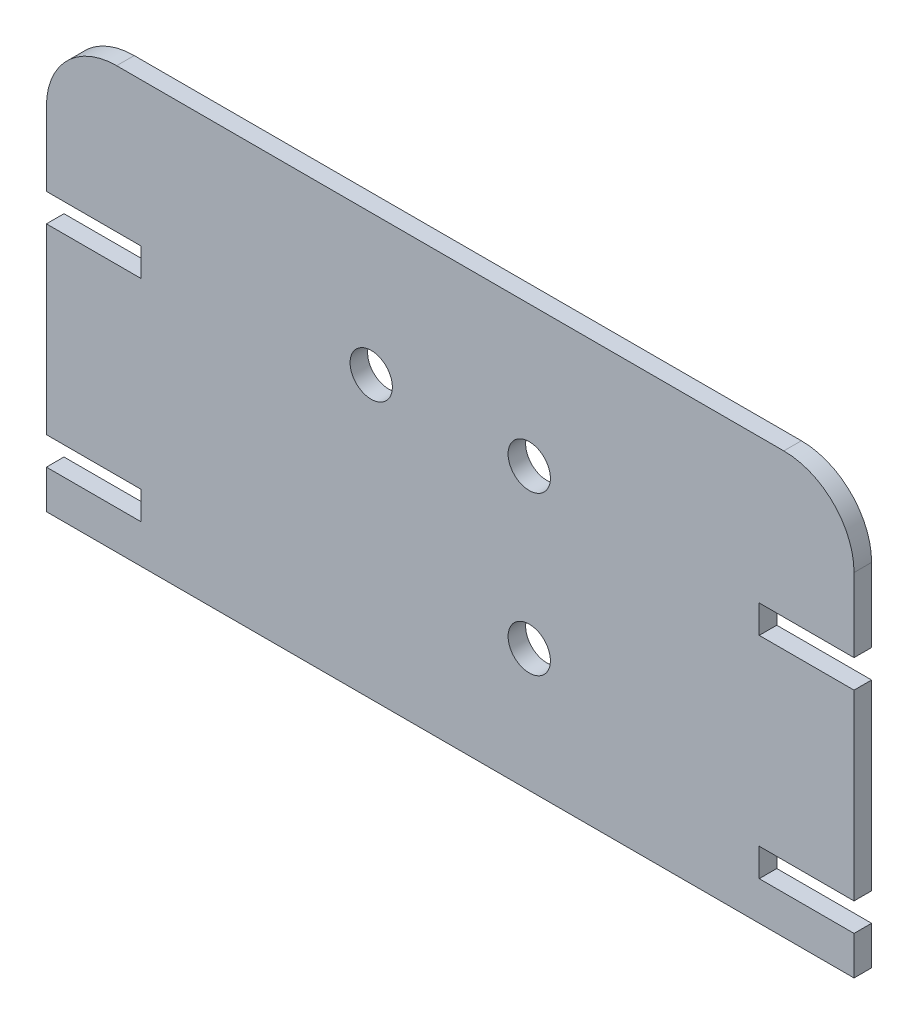
ISO-10303-21;
HEADER;
FILE_DESCRIPTION(('STEP AP214'),'2;1');
FILE_NAME('part.step','',(''),(''),'','','');
FILE_SCHEMA(('AUTOMOTIVE_DESIGN { 1 0 10303 214 1 1 1 1 }'));
ENDSEC;
DATA;
#1=APPLICATION_CONTEXT('core data for automotive mechanical design processes');
#2=APPLICATION_PROTOCOL_DEFINITION('international standard','automotive_design',2000,#1);
#3=PRODUCT_CONTEXT('',#1,'mechanical');
#4=PRODUCT('Part','Part','',(#3));
#5=PRODUCT_RELATED_PRODUCT_CATEGORY('part','',(#4));
#6=PRODUCT_DEFINITION_FORMATION('','',#4);
#7=PRODUCT_DEFINITION_CONTEXT('part definition',#1,'design');
#8=PRODUCT_DEFINITION('design','',#6,#7);
#9=PRODUCT_DEFINITION_SHAPE('','',#8);
#10=(LENGTH_UNIT() NAMED_UNIT(*) SI_UNIT(.MILLI.,.METRE.));
#11=(NAMED_UNIT(*) PLANE_ANGLE_UNIT() SI_UNIT($,.RADIAN.));
#12=(NAMED_UNIT(*) SI_UNIT($,.STERADIAN.) SOLID_ANGLE_UNIT());
#13=UNCERTAINTY_MEASURE_WITH_UNIT(LENGTH_MEASURE(1.E-05),#10,'distance_accuracy_value','');
#14=(GEOMETRIC_REPRESENTATION_CONTEXT(3) GLOBAL_UNCERTAINTY_ASSIGNED_CONTEXT((#13)) GLOBAL_UNIT_ASSIGNED_CONTEXT((#10,
#11,#12)) REPRESENTATION_CONTEXT('',''));
#15=CARTESIAN_POINT('',(0.,0.,0.));
#16=DIRECTION('',(0.,0.,1.));
#17=DIRECTION('',(1.,0.,0.));
#18=AXIS2_PLACEMENT_3D('',#15,#16,#17);
#19=CARTESIAN_POINT('',(115.,-60.,5.));
#20=DIRECTION('',(-1.,0.,0.));
#21=DIRECTION('',(0.,0.,1.));
#22=AXIS2_PLACEMENT_3D('',#19,#20,#21);
#23=PLANE('',#22);
#24=DIRECTION('',(0.,1.,0.));
#25=VECTOR('',#24,1.);
#26=CARTESIAN_POINT('',(115.,-60.,0.));
#27=LINE('',#26,#25);
#28=CARTESIAN_POINT('',(115.,19.0000000007499,0.));
#29=VERTEX_POINT('',#28);
#30=CARTESIAN_POINT('',(115.,40.,0.));
#31=VERTEX_POINT('',#30);
#32=EDGE_CURVE('E240',#29,#31,#27,.T.);
#33=ORIENTED_EDGE('',*,*,#32,.T.);
#34=DIRECTION('',(0.,0.,-1.));
#35=VECTOR('',#34,1.);
#36=CARTESIAN_POINT('',(115.,40.,5.));
#37=LINE('',#36,#35);
#38=CARTESIAN_POINT('',(115.,40.,5.));
#39=VERTEX_POINT('',#38);
#40=EDGE_CURVE('E62',#31,#39,#37,.F.);
#41=ORIENTED_EDGE('',*,*,#40,.T.);
#42=DIRECTION('',(0.,1.,0.));
#43=VECTOR('',#42,1.);
#44=CARTESIAN_POINT('',(115.,-60.,5.));
#45=LINE('',#44,#43);
#46=CARTESIAN_POINT('',(115.,19.0000000007499,5.));
#47=VERTEX_POINT('',#46);
#48=EDGE_CURVE('E251',#47,#39,#45,.T.);
#49=ORIENTED_EDGE('',*,*,#48,.F.);
#50=DIRECTION('',(0.,0.,-1.));
#51=VECTOR('',#50,1.);
#52=CARTESIAN_POINT('',(115.,19.0000000007499,5.001));
#53=LINE('',#52,#51);
#54=EDGE_CURVE('E293',#47,#29,#53,.T.);
#55=ORIENTED_EDGE('',*,*,#54,.T.);
#56=EDGE_LOOP('',(#33,#41,#49,#55));
#57=FACE_BOUND('',#56,.T.);
#58=ADVANCED_FACE('F38',(#57),#23,.F.);
#59=CARTESIAN_POINT('',(115.,-40.9999999999375,0.));
#60=VERTEX_POINT('',#59);
#61=CARTESIAN_POINT('',(115.,11.0000000000625,0.));
#62=VERTEX_POINT('',#61);
#63=EDGE_CURVE('E239',#60,#62,#27,.T.);
#64=ORIENTED_EDGE('',*,*,#63,.T.);
#65=DIRECTION('',(0.,0.,-1.));
#66=VECTOR('',#65,1.);
#67=CARTESIAN_POINT('',(115.,11.0000000000625,5.001));
#68=LINE('',#67,#66);
#69=CARTESIAN_POINT('',(115.,11.0000000000625,5.));
#70=VERTEX_POINT('',#69);
#71=EDGE_CURVE('E387',#70,#62,#68,.T.);
#72=ORIENTED_EDGE('',*,*,#71,.F.);
#73=CARTESIAN_POINT('',(115.,-40.9999999999375,5.));
#74=VERTEX_POINT('',#73);
#75=EDGE_CURVE('E314',#74,#70,#45,.T.);
#76=ORIENTED_EDGE('',*,*,#75,.F.);
#77=DIRECTION('',(0.,0.,-1.));
#78=VECTOR('',#77,1.);
#79=CARTESIAN_POINT('',(115.,-40.9999999999375,5.001));
#80=LINE('',#79,#78);
#81=EDGE_CURVE('E346',#74,#60,#80,.T.);
#82=ORIENTED_EDGE('',*,*,#81,.T.);
#83=EDGE_LOOP('',(#64,#72,#76,#82));
#84=FACE_BOUND('',#83,.T.);
#85=ADVANCED_FACE('F431',(#84),#23,.F.);
#86=CARTESIAN_POINT('',(-115.,-60.,5.));
#87=DIRECTION('',(1.,0.,0.));
#88=DIRECTION('',(0.,0.,-1.));
#89=AXIS2_PLACEMENT_3D('',#86,#87,#88);
#90=PLANE('',#89);
#91=DIRECTION('',(0.,-1.,0.));
#92=VECTOR('',#91,1.);
#93=CARTESIAN_POINT('',(-115.,-60.,5.));
#94=LINE('',#93,#92);
#95=CARTESIAN_POINT('',(-115.,-49.000000000625,5.));
#96=VERTEX_POINT('',#95);
#97=CARTESIAN_POINT('',(-115.,-60.,5.));
#98=VERTEX_POINT('',#97);
#99=EDGE_CURVE('E222',#96,#98,#94,.T.);
#100=ORIENTED_EDGE('',*,*,#99,.F.);
#101=DIRECTION('',(0.,0.,-1.));
#102=VECTOR('',#101,1.);
#103=CARTESIAN_POINT('',(-115.,-49.000000000625,5.001));
#104=LINE('',#103,#102);
#105=CARTESIAN_POINT('',(-115.,-49.000000000625,0.));
#106=VERTEX_POINT('',#105);
#107=EDGE_CURVE('E202',#96,#106,#104,.T.);
#108=ORIENTED_EDGE('',*,*,#107,.T.);
#109=DIRECTION('',(0.,-1.,0.));
#110=VECTOR('',#109,1.);
#111=CARTESIAN_POINT('',(-115.,-60.,0.));
#112=LINE('',#111,#110);
#113=CARTESIAN_POINT('',(-115.,-60.,0.));
#114=VERTEX_POINT('',#113);
#115=EDGE_CURVE('E244',#106,#114,#112,.T.);
#116=ORIENTED_EDGE('',*,*,#115,.T.);
#117=DIRECTION('',(0.,0.,-1.));
#118=VECTOR('',#117,1.);
#119=CARTESIAN_POINT('',(-115.,-60.,5.));
#120=LINE('',#119,#118);
#121=EDGE_CURVE('E255',#98,#114,#120,.T.);
#122=ORIENTED_EDGE('',*,*,#121,.F.);
#123=EDGE_LOOP('',(#100,#108,#116,#122));
#124=FACE_BOUND('',#123,.T.);
#125=ADVANCED_FACE('F327',(#124),#90,.F.);
#126=CARTESIAN_POINT('',(-115.,11.0000000000625,0.));
#127=VERTEX_POINT('',#126);
#128=CARTESIAN_POINT('',(-115.,-40.9999999999375,0.));
#129=VERTEX_POINT('',#128);
#130=EDGE_CURVE('E211',#127,#129,#112,.T.);
#131=ORIENTED_EDGE('',*,*,#130,.T.);
#132=DIRECTION('',(0.,0.,-1.));
#133=VECTOR('',#132,1.);
#134=CARTESIAN_POINT('',(-115.,-40.9999999999375,5.001));
#135=LINE('',#134,#133);
#136=CARTESIAN_POINT('',(-115.,-40.9999999999375,5.));
#137=VERTEX_POINT('',#136);
#138=EDGE_CURVE('E194',#137,#129,#135,.T.);
#139=ORIENTED_EDGE('',*,*,#138,.F.);
#140=CARTESIAN_POINT('',(-115.,11.0000000000625,5.));
#141=VERTEX_POINT('',#140);
#142=EDGE_CURVE('E209',#141,#137,#94,.T.);
#143=ORIENTED_EDGE('',*,*,#142,.F.);
#144=DIRECTION('',(0.,0.,-1.));
#145=VECTOR('',#144,1.);
#146=CARTESIAN_POINT('',(-115.,11.0000000000625,5.001));
#147=LINE('',#146,#145);
#148=EDGE_CURVE('E300',#141,#127,#147,.T.);
#149=ORIENTED_EDGE('',*,*,#148,.T.);
#150=EDGE_LOOP('',(#131,#139,#143,#149));
#151=FACE_BOUND('',#150,.T.);
#152=ADVANCED_FACE('F207',(#151),#90,.F.);
#153=CARTESIAN_POINT('',(115.,-60.,0.));
#154=VERTEX_POINT('',#153);
#155=CARTESIAN_POINT('',(115.,-49.000000000625,0.));
#156=VERTEX_POINT('',#155);
#157=EDGE_CURVE('E234',#154,#156,#27,.T.);
#158=ORIENTED_EDGE('',*,*,#157,.T.);
#159=DIRECTION('',(0.,0.,-1.));
#160=VECTOR('',#159,1.);
#161=CARTESIAN_POINT('',(115.,-49.000000000625,5.001));
#162=LINE('',#161,#160);
#163=CARTESIAN_POINT('',(115.,-49.000000000625,5.));
#164=VERTEX_POINT('',#163);
#165=EDGE_CURVE('E342',#164,#156,#162,.T.);
#166=ORIENTED_EDGE('',*,*,#165,.F.);
#167=CARTESIAN_POINT('',(115.,-60.,5.));
#168=VERTEX_POINT('',#167);
#169=EDGE_CURVE('E286',#168,#164,#45,.T.);
#170=ORIENTED_EDGE('',*,*,#169,.F.);
#171=DIRECTION('',(0.,0.,-1.));
#172=VECTOR('',#171,1.);
#173=CARTESIAN_POINT('',(115.,-60.,5.));
#174=LINE('',#173,#172);
#175=EDGE_CURVE('E233',#168,#154,#174,.T.);
#176=ORIENTED_EDGE('',*,*,#175,.T.);
#177=EDGE_LOOP('',(#158,#166,#170,#176));
#178=FACE_BOUND('',#177,.T.);
#179=ADVANCED_FACE('F341',(#178),#23,.F.);
#180=CARTESIAN_POINT('',(-115.,60.,5.));
#181=DIRECTION('',(0.,-1.,0.));
#182=DIRECTION('',(0.,0.,-1.));
#183=AXIS2_PLACEMENT_3D('',#180,#181,#182);
#184=PLANE('',#183);
#185=DIRECTION('',(-1.,0.,0.));
#186=VECTOR('',#185,1.);
#187=CARTESIAN_POINT('',(-115.,60.,5.));
#188=LINE('',#187,#186);
#189=CARTESIAN_POINT('',(95.,60.,5.));
#190=VERTEX_POINT('',#189);
#191=CARTESIAN_POINT('',(-95.,60.,5.));
#192=VERTEX_POINT('',#191);
#193=EDGE_CURVE('E227',#190,#192,#188,.T.);
#194=ORIENTED_EDGE('',*,*,#193,.F.);
#195=DIRECTION('',(0.,0.,-1.));
#196=VECTOR('',#195,1.);
#197=CARTESIAN_POINT('',(95.,60.,5.));
#198=LINE('',#197,#196);
#199=CARTESIAN_POINT('',(95.,60.,0.));
#200=VERTEX_POINT('',#199);
#201=EDGE_CURVE('E262',#190,#200,#198,.T.);
#202=ORIENTED_EDGE('',*,*,#201,.T.);
#203=DIRECTION('',(-1.,0.,0.));
#204=VECTOR('',#203,1.);
#205=CARTESIAN_POINT('',(-115.,60.,0.));
#206=LINE('',#205,#204);
#207=CARTESIAN_POINT('',(-95.,60.,0.));
#208=VERTEX_POINT('',#207);
#209=EDGE_CURVE('E238',#200,#208,#206,.T.);
#210=ORIENTED_EDGE('',*,*,#209,.T.);
#211=DIRECTION('',(0.,0.,-1.));
#212=VECTOR('',#211,1.);
#213=CARTESIAN_POINT('',(-95.,60.,5.));
#214=LINE('',#213,#212);
#215=EDGE_CURVE('E259',#208,#192,#214,.F.);
#216=ORIENTED_EDGE('',*,*,#215,.T.);
#217=EDGE_LOOP('',(#194,#202,#210,#216));
#218=FACE_BOUND('',#217,.T.);
#219=ADVANCED_FACE('F282',(#218),#184,.F.);
#220=CARTESIAN_POINT('',(-115.,40.,5.));
#221=VERTEX_POINT('',#220);
#222=CARTESIAN_POINT('',(-115.,19.0000000007499,5.));
#223=VERTEX_POINT('',#222);
#224=EDGE_CURVE('E221',#221,#223,#94,.T.);
#225=ORIENTED_EDGE('',*,*,#224,.F.);
#226=DIRECTION('',(0.,0.,-1.));
#227=VECTOR('',#226,1.);
#228=CARTESIAN_POINT('',(-115.,40.,5.));
#229=LINE('',#228,#227);
#230=CARTESIAN_POINT('',(-115.,40.,0.));
#231=VERTEX_POINT('',#230);
#232=EDGE_CURVE('E11',#221,#231,#229,.T.);
#233=ORIENTED_EDGE('',*,*,#232,.T.);
#234=CARTESIAN_POINT('',(-115.,19.0000000007499,0.));
#235=VERTEX_POINT('',#234);
#236=EDGE_CURVE('E245',#231,#235,#112,.T.);
#237=ORIENTED_EDGE('',*,*,#236,.T.);
#238=DIRECTION('',(0.,0.,-1.));
#239=VECTOR('',#238,1.);
#240=CARTESIAN_POINT('',(-115.,19.0000000007499,5.001));
#241=LINE('',#240,#239);
#242=EDGE_CURVE('E310',#223,#235,#241,.T.);
#243=ORIENTED_EDGE('',*,*,#242,.F.);
#244=EDGE_LOOP('',(#225,#233,#237,#243));
#245=FACE_BOUND('',#244,.T.);
#246=ADVANCED_FACE('F423',(#245),#90,.F.);
#247=CARTESIAN_POINT('',(-115.,-60.,5.));
#248=DIRECTION('',(0.,1.,0.));
#249=DIRECTION('',(0.,0.,1.));
#250=AXIS2_PLACEMENT_3D('',#247,#248,#249);
#251=PLANE('',#250);
#252=DIRECTION('',(1.,0.,0.));
#253=VECTOR('',#252,1.);
#254=CARTESIAN_POINT('',(-115.,-60.,0.));
#255=LINE('',#254,#253);
#256=EDGE_CURVE('E248',#114,#154,#255,.T.);
#257=ORIENTED_EDGE('',*,*,#256,.T.);
#258=ORIENTED_EDGE('',*,*,#175,.F.);
#259=DIRECTION('',(1.,0.,0.));
#260=VECTOR('',#259,1.);
#261=CARTESIAN_POINT('',(-115.,-60.,5.));
#262=LINE('',#261,#260);
#263=EDGE_CURVE('E226',#98,#168,#262,.T.);
#264=ORIENTED_EDGE('',*,*,#263,.F.);
#265=ORIENTED_EDGE('',*,*,#121,.T.);
#266=EDGE_LOOP('',(#257,#258,#264,#265));
#267=FACE_BOUND('',#266,.T.);
#268=ADVANCED_FACE('F332',(#267),#251,.F.);
#269=CARTESIAN_POINT('',(0.,0.,5.));
#270=DIRECTION('',(0.,0.,-1.));
#271=DIRECTION('',(-1.,0.,0.));
#272=AXIS2_PLACEMENT_3D('',#269,#270,#271);
#273=PLANE('',#272);
#274=CARTESIAN_POINT('',(22.5,-25.,5.));
#275=DIRECTION('',(0.,0.,1.));
#276=DIRECTION('',(1.,0.,0.));
#277=AXIS2_PLACEMENT_3D('',#274,#275,#276);
#278=CIRCLE('',#277,6.025);
#279=CARTESIAN_POINT('',(28.525,-25.,5.));
#280=VERTEX_POINT('',#279);
#281=EDGE_CURVE('E530',#280,#280,#278,.T.);
#282=ORIENTED_EDGE('',*,*,#281,.F.);
#283=EDGE_LOOP('',(#282));
#284=FACE_BOUND('',#283,.T.);
#285=CARTESIAN_POINT('',(-22.5,20.,5.));
#286=DIRECTION('',(0.,0.,1.));
#287=DIRECTION('',(1.,0.,0.));
#288=AXIS2_PLACEMENT_3D('',#285,#286,#287);
#289=CIRCLE('',#288,6.025);
#290=CARTESIAN_POINT('',(-16.475,20.,5.));
#291=VERTEX_POINT('',#290);
#292=EDGE_CURVE('E521',#291,#291,#289,.T.);
#293=ORIENTED_EDGE('',*,*,#292,.F.);
#294=EDGE_LOOP('',(#293));
#295=FACE_BOUND('',#294,.T.);
#296=CARTESIAN_POINT('',(22.5,20.,5.));
#297=DIRECTION('',(0.,0.,1.));
#298=DIRECTION('',(1.,0.,0.));
#299=AXIS2_PLACEMENT_3D('',#296,#297,#298);
#300=CIRCLE('',#299,6.025);
#301=CARTESIAN_POINT('',(28.525,20.,5.));
#302=VERTEX_POINT('',#301);
#303=EDGE_CURVE('E361',#302,#302,#300,.T.);
#304=ORIENTED_EDGE('',*,*,#303,.F.);
#305=EDGE_LOOP('',(#304));
#306=FACE_BOUND('',#305,.T.);
#307=ORIENTED_EDGE('',*,*,#48,.T.);
#308=CARTESIAN_POINT('',(95.,40.,5.));
#309=DIRECTION('',(0.,0.,-1.));
#310=DIRECTION('',(-1.,0.,0.));
#311=AXIS2_PLACEMENT_3D('',#308,#309,#310);
#312=CIRCLE('',#311,20.);
#313=EDGE_CURVE('E47',#39,#190,#312,.F.);
#314=ORIENTED_EDGE('',*,*,#313,.T.);
#315=ORIENTED_EDGE('',*,*,#193,.T.);
#316=CARTESIAN_POINT('',(-95.,40.,5.));
#317=DIRECTION('',(0.,0.,-1.));
#318=DIRECTION('',(-1.,0.,0.));
#319=AXIS2_PLACEMENT_3D('',#316,#317,#318);
#320=CIRCLE('',#319,20.);
#321=EDGE_CURVE('E54',#192,#221,#320,.F.);
#322=ORIENTED_EDGE('',*,*,#321,.T.);
#323=ORIENTED_EDGE('',*,*,#224,.T.);
#324=DIRECTION('',(-1.,0.,0.));
#325=VECTOR('',#324,1.);
#326=CARTESIAN_POINT('',(-88.,19.0000000007499,5.));
#327=LINE('',#326,#325);
#328=CARTESIAN_POINT('',(-88.,19.0000000007499,5.));
#329=VERTEX_POINT('',#328);
#330=EDGE_CURVE('E295',#329,#223,#327,.T.);
#331=ORIENTED_EDGE('',*,*,#330,.F.);
#332=DIRECTION('',(0.,1.,0.));
#333=VECTOR('',#332,1.);
#334=CARTESIAN_POINT('',(-88.,11.0000000000625,5.));
#335=LINE('',#334,#333);
#336=CARTESIAN_POINT('',(-88.,11.0000000000625,5.));
#337=VERTEX_POINT('',#336);
#338=EDGE_CURVE('E201',#337,#329,#335,.T.);
#339=ORIENTED_EDGE('',*,*,#338,.F.);
#340=DIRECTION('',(1.,0.,0.));
#341=VECTOR('',#340,1.);
#342=CARTESIAN_POINT('',(-115.,11.0000000000625,5.));
#343=LINE('',#342,#341);
#344=EDGE_CURVE('E219',#141,#337,#343,.T.);
#345=ORIENTED_EDGE('',*,*,#344,.F.);
#346=ORIENTED_EDGE('',*,*,#142,.T.);
#347=DIRECTION('',(-1.,0.,0.));
#348=VECTOR('',#347,1.);
#349=CARTESIAN_POINT('',(-88.,-40.9999999999375,5.));
#350=LINE('',#349,#348);
#351=CARTESIAN_POINT('',(-88.,-40.9999999999375,5.));
#352=VERTEX_POINT('',#351);
#353=EDGE_CURVE('E190',#352,#137,#350,.T.);
#354=ORIENTED_EDGE('',*,*,#353,.F.);
#355=DIRECTION('',(0.,1.,0.));
#356=VECTOR('',#355,1.);
#357=CARTESIAN_POINT('',(-88.,-49.000000000625,5.));
#358=LINE('',#357,#356);
#359=CARTESIAN_POINT('',(-88.,-49.000000000625,5.));
#360=VERTEX_POINT('',#359);
#361=EDGE_CURVE('E543',#360,#352,#358,.T.);
#362=ORIENTED_EDGE('',*,*,#361,.F.);
#363=DIRECTION('',(1.,0.,0.));
#364=VECTOR('',#363,1.);
#365=CARTESIAN_POINT('',(-115.,-49.000000000625,5.));
#366=LINE('',#365,#364);
#367=EDGE_CURVE('E546',#96,#360,#366,.T.);
#368=ORIENTED_EDGE('',*,*,#367,.F.);
#369=ORIENTED_EDGE('',*,*,#99,.T.);
#370=ORIENTED_EDGE('',*,*,#263,.T.);
#371=ORIENTED_EDGE('',*,*,#169,.T.);
#372=DIRECTION('',(1.,0.,0.));
#373=VECTOR('',#372,1.);
#374=CARTESIAN_POINT('',(115.,-49.000000000625,5.));
#375=LINE('',#374,#373);
#376=CARTESIAN_POINT('',(88.,-49.000000000625,5.));
#377=VERTEX_POINT('',#376);
#378=EDGE_CURVE('E383',#377,#164,#375,.T.);
#379=ORIENTED_EDGE('',*,*,#378,.F.);
#380=DIRECTION('',(0.,-1.,0.));
#381=VECTOR('',#380,1.);
#382=CARTESIAN_POINT('',(88.,-49.000000000625,5.));
#383=LINE('',#382,#381);
#384=CARTESIAN_POINT('',(88.,-40.9999999999375,5.));
#385=VERTEX_POINT('',#384);
#386=EDGE_CURVE('E568',#385,#377,#383,.T.);
#387=ORIENTED_EDGE('',*,*,#386,.F.);
#388=DIRECTION('',(-1.,0.,0.));
#389=VECTOR('',#388,1.);
#390=CARTESIAN_POINT('',(88.,-40.9999999999375,5.));
#391=LINE('',#390,#389);
#392=EDGE_CURVE('E572',#74,#385,#391,.T.);
#393=ORIENTED_EDGE('',*,*,#392,.F.);
#394=ORIENTED_EDGE('',*,*,#75,.T.);
#395=DIRECTION('',(1.,0.,0.));
#396=VECTOR('',#395,1.);
#397=CARTESIAN_POINT('',(115.,11.0000000000625,5.));
#398=LINE('',#397,#396);
#399=CARTESIAN_POINT('',(88.,11.0000000000625,5.));
#400=VERTEX_POINT('',#399);
#401=EDGE_CURVE('E357',#400,#70,#398,.T.);
#402=ORIENTED_EDGE('',*,*,#401,.F.);
#403=DIRECTION('',(0.,-1.,0.));
#404=VECTOR('',#403,1.);
#405=CARTESIAN_POINT('',(88.,11.0000000000625,5.));
#406=LINE('',#405,#404);
#407=CARTESIAN_POINT('',(88.,19.0000000007499,5.));
#408=VERTEX_POINT('',#407);
#409=EDGE_CURVE('E360',#408,#400,#406,.T.);
#410=ORIENTED_EDGE('',*,*,#409,.F.);
#411=DIRECTION('',(-1.,0.,0.));
#412=VECTOR('',#411,1.);
#413=CARTESIAN_POINT('',(88.,19.0000000007499,5.));
#414=LINE('',#413,#412);
#415=EDGE_CURVE('E365',#47,#408,#414,.T.);
#416=ORIENTED_EDGE('',*,*,#415,.F.);
#417=EDGE_LOOP('',(#307,#314,#315,#322,#323,#331,#339,#345,#346,#354,#362,#368,#369,#370,#371,
#379,#387,#393,#394,#402,#410,#416));
#418=FACE_BOUND('',#417,.T.);
#419=ADVANCED_FACE('F216',(#284,#295,#306,#418),#273,.F.);
#420=CARTESIAN_POINT('',(0.,0.,0.));
#421=DIRECTION('',(0.,0.,-1.));
#422=DIRECTION('',(-1.,0.,0.));
#423=AXIS2_PLACEMENT_3D('',#420,#421,#422);
#424=PLANE('',#423);
#425=CARTESIAN_POINT('',(22.5,-25.,0.));
#426=DIRECTION('',(0.,0.,-1.));
#427=DIRECTION('',(-1.,0.,0.));
#428=AXIS2_PLACEMENT_3D('',#425,#426,#427);
#429=CIRCLE('',#428,6.025);
#430=CARTESIAN_POINT('',(16.475,-25.,0.));
#431=VERTEX_POINT('',#430);
#432=EDGE_CURVE('E536',#431,#431,#429,.F.);
#433=ORIENTED_EDGE('',*,*,#432,.T.);
#434=EDGE_LOOP('',(#433));
#435=FACE_BOUND('',#434,.T.);
#436=CARTESIAN_POINT('',(-22.5,20.,0.));
#437=DIRECTION('',(0.,0.,-1.));
#438=DIRECTION('',(-1.,0.,0.));
#439=AXIS2_PLACEMENT_3D('',#436,#437,#438);
#440=CIRCLE('',#439,6.025);
#441=CARTESIAN_POINT('',(-28.525,20.,0.));
#442=VERTEX_POINT('',#441);
#443=EDGE_CURVE('E518',#442,#442,#440,.F.);
#444=ORIENTED_EDGE('',*,*,#443,.T.);
#445=EDGE_LOOP('',(#444));
#446=FACE_BOUND('',#445,.T.);
#447=CARTESIAN_POINT('',(22.5,20.,0.));
#448=DIRECTION('',(0.,0.,-1.));
#449=DIRECTION('',(-1.,0.,0.));
#450=AXIS2_PLACEMENT_3D('',#447,#448,#449);
#451=CIRCLE('',#450,6.025);
#452=CARTESIAN_POINT('',(16.475,20.,0.));
#453=VERTEX_POINT('',#452);
#454=EDGE_CURVE('E524',#453,#453,#451,.F.);
#455=ORIENTED_EDGE('',*,*,#454,.T.);
#456=EDGE_LOOP('',(#455));
#457=FACE_BOUND('',#456,.T.);
#458=ORIENTED_EDGE('',*,*,#209,.F.);
#459=CARTESIAN_POINT('',(95.,40.,0.));
#460=DIRECTION('',(0.,0.,-1.));
#461=DIRECTION('',(-1.,0.,0.));
#462=AXIS2_PLACEMENT_3D('',#459,#460,#461);
#463=CIRCLE('',#462,20.);
#464=EDGE_CURVE('E269',#200,#31,#463,.T.);
#465=ORIENTED_EDGE('',*,*,#464,.T.);
#466=ORIENTED_EDGE('',*,*,#32,.F.);
#467=DIRECTION('',(1.,0.,0.));
#468=VECTOR('',#467,1.);
#469=CARTESIAN_POINT('',(88.,19.0000000007499,0.));
#470=LINE('',#469,#468);
#471=CARTESIAN_POINT('',(88.,19.0000000007499,0.));
#472=VERTEX_POINT('',#471);
#473=EDGE_CURVE('E369',#472,#29,#470,.T.);
#474=ORIENTED_EDGE('',*,*,#473,.F.);
#475=DIRECTION('',(0.,1.,0.));
#476=VECTOR('',#475,1.);
#477=CARTESIAN_POINT('',(88.,11.0000000000625,0.));
#478=LINE('',#477,#476);
#479=CARTESIAN_POINT('',(88.,11.0000000000625,0.));
#480=VERTEX_POINT('',#479);
#481=EDGE_CURVE('E376',#480,#472,#478,.T.);
#482=ORIENTED_EDGE('',*,*,#481,.F.);
#483=DIRECTION('',(-1.,0.,0.));
#484=VECTOR('',#483,1.);
#485=CARTESIAN_POINT('',(115.,11.0000000000625,0.));
#486=LINE('',#485,#484);
#487=EDGE_CURVE('E372',#62,#480,#486,.T.);
#488=ORIENTED_EDGE('',*,*,#487,.F.);
#489=ORIENTED_EDGE('',*,*,#63,.F.);
#490=DIRECTION('',(1.,0.,0.));
#491=VECTOR('',#490,1.);
#492=CARTESIAN_POINT('',(88.,-40.9999999999375,0.));
#493=LINE('',#492,#491);
#494=CARTESIAN_POINT('',(88.,-40.9999999999375,0.));
#495=VERTEX_POINT('',#494);
#496=EDGE_CURVE('E576',#495,#60,#493,.T.);
#497=ORIENTED_EDGE('',*,*,#496,.F.);
#498=DIRECTION('',(0.,1.,0.));
#499=VECTOR('',#498,1.);
#500=CARTESIAN_POINT('',(88.,-49.000000000625,0.));
#501=LINE('',#500,#499);
#502=CARTESIAN_POINT('',(88.,-49.000000000625,0.));
#503=VERTEX_POINT('',#502);
#504=EDGE_CURVE('E353',#503,#495,#501,.T.);
#505=ORIENTED_EDGE('',*,*,#504,.F.);
#506=DIRECTION('',(-1.,0.,0.));
#507=VECTOR('',#506,1.);
#508=CARTESIAN_POINT('',(115.,-49.000000000625,0.));
#509=LINE('',#508,#507);
#510=EDGE_CURVE('E338',#156,#503,#509,.T.);
#511=ORIENTED_EDGE('',*,*,#510,.F.);
#512=ORIENTED_EDGE('',*,*,#157,.F.);
#513=ORIENTED_EDGE('',*,*,#256,.F.);
#514=ORIENTED_EDGE('',*,*,#115,.F.);
#515=DIRECTION('',(-1.,0.,0.));
#516=VECTOR('',#515,1.);
#517=CARTESIAN_POINT('',(-115.,-49.000000000625,0.));
#518=LINE('',#517,#516);
#519=CARTESIAN_POINT('',(-88.,-49.000000000625,0.));
#520=VERTEX_POINT('',#519);
#521=EDGE_CURVE('E213',#520,#106,#518,.T.);
#522=ORIENTED_EDGE('',*,*,#521,.F.);
#523=DIRECTION('',(0.,-1.,0.));
#524=VECTOR('',#523,1.);
#525=CARTESIAN_POINT('',(-88.,-49.000000000625,0.));
#526=LINE('',#525,#524);
#527=CARTESIAN_POINT('',(-88.,-40.9999999999375,0.));
#528=VERTEX_POINT('',#527);
#529=EDGE_CURVE('E553',#528,#520,#526,.T.);
#530=ORIENTED_EDGE('',*,*,#529,.F.);
#531=DIRECTION('',(1.,0.,0.));
#532=VECTOR('',#531,1.);
#533=CARTESIAN_POINT('',(-88.,-40.9999999999375,0.));
#534=LINE('',#533,#532);
#535=EDGE_CURVE('E550',#129,#528,#534,.T.);
#536=ORIENTED_EDGE('',*,*,#535,.F.);
#537=ORIENTED_EDGE('',*,*,#130,.F.);
#538=DIRECTION('',(-1.,0.,0.));
#539=VECTOR('',#538,1.);
#540=CARTESIAN_POINT('',(-115.,11.0000000000625,0.));
#541=LINE('',#540,#539);
#542=CARTESIAN_POINT('',(-88.,11.0000000000625,0.));
#543=VERTEX_POINT('',#542);
#544=EDGE_CURVE('E405',#543,#127,#541,.T.);
#545=ORIENTED_EDGE('',*,*,#544,.F.);
#546=DIRECTION('',(0.,-1.,0.));
#547=VECTOR('',#546,1.);
#548=CARTESIAN_POINT('',(-88.,11.0000000000625,0.));
#549=LINE('',#548,#547);
#550=CARTESIAN_POINT('',(-88.,19.0000000007499,0.));
#551=VERTEX_POINT('',#550);
#552=EDGE_CURVE('E401',#551,#543,#549,.T.);
#553=ORIENTED_EDGE('',*,*,#552,.F.);
#554=DIRECTION('',(1.,0.,0.));
#555=VECTOR('',#554,1.);
#556=CARTESIAN_POINT('',(-88.,19.0000000007499,0.));
#557=LINE('',#556,#555);
#558=EDGE_CURVE('E397',#235,#551,#557,.T.);
#559=ORIENTED_EDGE('',*,*,#558,.F.);
#560=ORIENTED_EDGE('',*,*,#236,.F.);
#561=CARTESIAN_POINT('',(-95.,40.,0.));
#562=DIRECTION('',(0.,0.,-1.));
#563=DIRECTION('',(-1.,0.,0.));
#564=AXIS2_PLACEMENT_3D('',#561,#562,#563);
#565=CIRCLE('',#564,20.);
#566=EDGE_CURVE('E266',#231,#208,#565,.T.);
#567=ORIENTED_EDGE('',*,*,#566,.T.);
#568=EDGE_LOOP('',(#458,#465,#466,#474,#482,#488,#489,#497,#505,#511,#512,#513,#514,#522,#530,
#536,#537,#545,#553,#559,#560,#567));
#569=FACE_BOUND('',#568,.T.);
#570=ADVANCED_FACE('F290',(#435,#446,#457,#569),#424,.T.);
#571=CARTESIAN_POINT('',(-115.,11.0000000000625,5.001));
#572=DIRECTION('',(0.,-1.,0.));
#573=DIRECTION('',(0.,0.,-1.));
#574=AXIS2_PLACEMENT_3D('',#571,#572,#573);
#575=PLANE('',#574);
#576=ORIENTED_EDGE('',*,*,#344,.T.);
#577=DIRECTION('',(0.,0.,-1.));
#578=VECTOR('',#577,1.);
#579=CARTESIAN_POINT('',(-88.,11.0000000000625,5.001));
#580=LINE('',#579,#578);
#581=EDGE_CURVE('E307',#337,#543,#580,.T.);
#582=ORIENTED_EDGE('',*,*,#581,.T.);
#583=ORIENTED_EDGE('',*,*,#544,.T.);
#584=ORIENTED_EDGE('',*,*,#148,.F.);
#585=EDGE_LOOP('',(#576,#582,#583,#584));
#586=FACE_BOUND('',#585,.T.);
#587=ADVANCED_FACE('F421',(#586),#575,.F.);
#588=CARTESIAN_POINT('',(-88.,11.0000000000625,5.001));
#589=DIRECTION('',(1.,0.,0.));
#590=DIRECTION('',(0.,0.,-1.));
#591=AXIS2_PLACEMENT_3D('',#588,#589,#590);
#592=PLANE('',#591);
#593=ORIENTED_EDGE('',*,*,#338,.T.);
#594=DIRECTION('',(0.,0.,-1.));
#595=VECTOR('',#594,1.);
#596=CARTESIAN_POINT('',(-88.,19.0000000007499,5.001));
#597=LINE('',#596,#595);
#598=EDGE_CURVE('E409',#329,#551,#597,.T.);
#599=ORIENTED_EDGE('',*,*,#598,.T.);
#600=ORIENTED_EDGE('',*,*,#552,.T.);
#601=ORIENTED_EDGE('',*,*,#581,.F.);
#602=EDGE_LOOP('',(#593,#599,#600,#601));
#603=FACE_BOUND('',#602,.T.);
#604=ADVANCED_FACE('F419',(#603),#592,.F.);
#605=CARTESIAN_POINT('',(-88.,19.0000000007499,5.001));
#606=DIRECTION('',(0.,1.,0.));
#607=DIRECTION('',(0.,0.,1.));
#608=AXIS2_PLACEMENT_3D('',#605,#606,#607);
#609=PLANE('',#608);
#610=ORIENTED_EDGE('',*,*,#330,.T.);
#611=ORIENTED_EDGE('',*,*,#242,.T.);
#612=ORIENTED_EDGE('',*,*,#558,.T.);
#613=ORIENTED_EDGE('',*,*,#598,.F.);
#614=EDGE_LOOP('',(#610,#611,#612,#613));
#615=FACE_BOUND('',#614,.T.);
#616=ADVANCED_FACE('F414',(#615),#609,.F.);
#617=CARTESIAN_POINT('',(-115.,-49.000000000625,5.001));
#618=DIRECTION('',(0.,-1.,0.));
#619=DIRECTION('',(0.,0.,-1.));
#620=AXIS2_PLACEMENT_3D('',#617,#618,#619);
#621=PLANE('',#620);
#622=ORIENTED_EDGE('',*,*,#367,.T.);
#623=DIRECTION('',(0.,0.,-1.));
#624=VECTOR('',#623,1.);
#625=CARTESIAN_POINT('',(-88.,-49.000000000625,5.001));
#626=LINE('',#625,#624);
#627=EDGE_CURVE('E561',#360,#520,#626,.T.);
#628=ORIENTED_EDGE('',*,*,#627,.T.);
#629=ORIENTED_EDGE('',*,*,#521,.T.);
#630=ORIENTED_EDGE('',*,*,#107,.F.);
#631=EDGE_LOOP('',(#622,#628,#629,#630));
#632=FACE_BOUND('',#631,.T.);
#633=ADVANCED_FACE('F466',(#632),#621,.F.);
#634=CARTESIAN_POINT('',(-88.,-49.000000000625,5.001));
#635=DIRECTION('',(1.,0.,0.));
#636=DIRECTION('',(0.,0.,-1.));
#637=AXIS2_PLACEMENT_3D('',#634,#635,#636);
#638=PLANE('',#637);
#639=ORIENTED_EDGE('',*,*,#361,.T.);
#640=DIRECTION('',(0.,0.,-1.));
#641=VECTOR('',#640,1.);
#642=CARTESIAN_POINT('',(-88.,-40.9999999999375,5.001));
#643=LINE('',#642,#641);
#644=EDGE_CURVE('E196',#352,#528,#643,.T.);
#645=ORIENTED_EDGE('',*,*,#644,.T.);
#646=ORIENTED_EDGE('',*,*,#529,.T.);
#647=ORIENTED_EDGE('',*,*,#627,.F.);
#648=EDGE_LOOP('',(#639,#645,#646,#647));
#649=FACE_BOUND('',#648,.T.);
#650=ADVANCED_FACE('F497',(#649),#638,.F.);
#651=CARTESIAN_POINT('',(-88.,-40.9999999999375,5.001));
#652=DIRECTION('',(0.,1.,0.));
#653=DIRECTION('',(0.,0.,1.));
#654=AXIS2_PLACEMENT_3D('',#651,#652,#653);
#655=PLANE('',#654);
#656=ORIENTED_EDGE('',*,*,#353,.T.);
#657=ORIENTED_EDGE('',*,*,#138,.T.);
#658=ORIENTED_EDGE('',*,*,#535,.T.);
#659=ORIENTED_EDGE('',*,*,#644,.F.);
#660=EDGE_LOOP('',(#656,#657,#658,#659));
#661=FACE_BOUND('',#660,.T.);
#662=ADVANCED_FACE('F192',(#661),#655,.F.);
#663=CARTESIAN_POINT('',(88.,-40.9999999999375,5.001));
#664=DIRECTION('',(0.,1.,0.));
#665=DIRECTION('',(0.,0.,1.));
#666=AXIS2_PLACEMENT_3D('',#663,#664,#665);
#667=PLANE('',#666);
#668=ORIENTED_EDGE('',*,*,#392,.T.);
#669=DIRECTION('',(0.,0.,-1.));
#670=VECTOR('',#669,1.);
#671=CARTESIAN_POINT('',(88.,-40.9999999999375,5.001));
#672=LINE('',#671,#670);
#673=EDGE_CURVE('E350',#385,#495,#672,.T.);
#674=ORIENTED_EDGE('',*,*,#673,.T.);
#675=ORIENTED_EDGE('',*,*,#496,.T.);
#676=ORIENTED_EDGE('',*,*,#81,.F.);
#677=EDGE_LOOP('',(#668,#674,#675,#676));
#678=FACE_BOUND('',#677,.T.);
#679=ADVANCED_FACE('F485',(#678),#667,.F.);
#680=CARTESIAN_POINT('',(88.,-49.000000000625,5.001));
#681=DIRECTION('',(-1.,0.,0.));
#682=DIRECTION('',(0.,0.,1.));
#683=AXIS2_PLACEMENT_3D('',#680,#681,#682);
#684=PLANE('',#683);
#685=ORIENTED_EDGE('',*,*,#386,.T.);
#686=DIRECTION('',(0.,0.,-1.));
#687=VECTOR('',#686,1.);
#688=CARTESIAN_POINT('',(88.,-49.000000000625,5.001));
#689=LINE('',#688,#687);
#690=EDGE_CURVE('E345',#377,#503,#689,.T.);
#691=ORIENTED_EDGE('',*,*,#690,.T.);
#692=ORIENTED_EDGE('',*,*,#504,.T.);
#693=ORIENTED_EDGE('',*,*,#673,.F.);
#694=EDGE_LOOP('',(#685,#691,#692,#693));
#695=FACE_BOUND('',#694,.T.);
#696=ADVANCED_FACE('F488',(#695),#684,.F.);
#697=CARTESIAN_POINT('',(115.,-49.000000000625,5.001));
#698=DIRECTION('',(0.,-1.,0.));
#699=DIRECTION('',(0.,0.,-1.));
#700=AXIS2_PLACEMENT_3D('',#697,#698,#699);
#701=PLANE('',#700);
#702=ORIENTED_EDGE('',*,*,#378,.T.);
#703=ORIENTED_EDGE('',*,*,#165,.T.);
#704=ORIENTED_EDGE('',*,*,#510,.T.);
#705=ORIENTED_EDGE('',*,*,#690,.F.);
#706=EDGE_LOOP('',(#702,#703,#704,#705));
#707=FACE_BOUND('',#706,.T.);
#708=ADVANCED_FACE('F475',(#707),#701,.F.);
#709=CARTESIAN_POINT('',(88.,19.0000000007499,5.001));
#710=DIRECTION('',(0.,1.,0.));
#711=DIRECTION('',(0.,0.,1.));
#712=AXIS2_PLACEMENT_3D('',#709,#710,#711);
#713=PLANE('',#712);
#714=ORIENTED_EDGE('',*,*,#415,.T.);
#715=DIRECTION('',(0.,0.,-1.));
#716=VECTOR('',#715,1.);
#717=CARTESIAN_POINT('',(88.,19.0000000007499,5.001));
#718=LINE('',#717,#716);
#719=EDGE_CURVE('E380',#408,#472,#718,.T.);
#720=ORIENTED_EDGE('',*,*,#719,.T.);
#721=ORIENTED_EDGE('',*,*,#473,.T.);
#722=ORIENTED_EDGE('',*,*,#54,.F.);
#723=EDGE_LOOP('',(#714,#720,#721,#722));
#724=FACE_BOUND('',#723,.T.);
#725=ADVANCED_FACE('F471',(#724),#713,.F.);
#726=CARTESIAN_POINT('',(88.,11.0000000000625,5.001));
#727=DIRECTION('',(-1.,0.,0.));
#728=DIRECTION('',(0.,0.,1.));
#729=AXIS2_PLACEMENT_3D('',#726,#727,#728);
#730=PLANE('',#729);
#731=ORIENTED_EDGE('',*,*,#409,.T.);
#732=DIRECTION('',(0.,0.,-1.));
#733=VECTOR('',#732,1.);
#734=CARTESIAN_POINT('',(88.,11.0000000000625,5.001));
#735=LINE('',#734,#733);
#736=EDGE_CURVE('E384',#400,#480,#735,.T.);
#737=ORIENTED_EDGE('',*,*,#736,.T.);
#738=ORIENTED_EDGE('',*,*,#481,.T.);
#739=ORIENTED_EDGE('',*,*,#719,.F.);
#740=EDGE_LOOP('',(#731,#737,#738,#739));
#741=FACE_BOUND('',#740,.T.);
#742=ADVANCED_FACE('F474',(#741),#730,.F.);
#743=CARTESIAN_POINT('',(115.,11.0000000000625,5.001));
#744=DIRECTION('',(0.,-1.,0.));
#745=DIRECTION('',(0.,0.,-1.));
#746=AXIS2_PLACEMENT_3D('',#743,#744,#745);
#747=PLANE('',#746);
#748=ORIENTED_EDGE('',*,*,#401,.T.);
#749=ORIENTED_EDGE('',*,*,#71,.T.);
#750=ORIENTED_EDGE('',*,*,#487,.T.);
#751=ORIENTED_EDGE('',*,*,#736,.F.);
#752=EDGE_LOOP('',(#748,#749,#750,#751));
#753=FACE_BOUND('',#752,.T.);
#754=ADVANCED_FACE('F477',(#753),#747,.F.);
#755=CARTESIAN_POINT('',(22.5,20.,-0.00100000000000013));
#756=DIRECTION('',(0.,0.,1.));
#757=DIRECTION('',(1.,0.,0.));
#758=AXIS2_PLACEMENT_3D('',#755,#756,#757);
#759=CYLINDRICAL_SURFACE('',#758,6.025);
#760=ORIENTED_EDGE('',*,*,#454,.F.);
#761=EDGE_LOOP('',(#760));
#762=FACE_BOUND('',#761,.T.);
#763=ORIENTED_EDGE('',*,*,#303,.T.);
#764=EDGE_LOOP('',(#763));
#765=FACE_BOUND('',#764,.T.);
#766=ADVANCED_FACE('F480',(#762,#765),#759,.F.);
#767=CARTESIAN_POINT('',(-22.5,20.,-0.00100000000000013));
#768=DIRECTION('',(0.,0.,1.));
#769=DIRECTION('',(1.,0.,0.));
#770=AXIS2_PLACEMENT_3D('',#767,#768,#769);
#771=CYLINDRICAL_SURFACE('',#770,6.025);
#772=ORIENTED_EDGE('',*,*,#443,.F.);
#773=EDGE_LOOP('',(#772));
#774=FACE_BOUND('',#773,.T.);
#775=ORIENTED_EDGE('',*,*,#292,.T.);
#776=EDGE_LOOP('',(#775));
#777=FACE_BOUND('',#776,.T.);
#778=ADVANCED_FACE('F506',(#774,#777),#771,.F.);
#779=CARTESIAN_POINT('',(22.5,-25.,-0.00100000000000013));
#780=DIRECTION('',(0.,0.,1.));
#781=DIRECTION('',(1.,0.,0.));
#782=AXIS2_PLACEMENT_3D('',#779,#780,#781);
#783=CYLINDRICAL_SURFACE('',#782,6.025);
#784=ORIENTED_EDGE('',*,*,#432,.F.);
#785=EDGE_LOOP('',(#784));
#786=FACE_BOUND('',#785,.T.);
#787=ORIENTED_EDGE('',*,*,#281,.T.);
#788=EDGE_LOOP('',(#787));
#789=FACE_BOUND('',#788,.T.);
#790=ADVANCED_FACE('F429',(#786,#789),#783,.F.);
#791=CARTESIAN_POINT('',(95.,40.,5.));
#792=DIRECTION('',(0.,0.,-1.));
#793=DIRECTION('',(-1.,0.,0.));
#794=AXIS2_PLACEMENT_3D('',#791,#792,#793);
#795=CYLINDRICAL_SURFACE('',#794,20.);
#796=ORIENTED_EDGE('',*,*,#313,.F.);
#797=ORIENTED_EDGE('',*,*,#40,.F.);
#798=ORIENTED_EDGE('',*,*,#464,.F.);
#799=ORIENTED_EDGE('',*,*,#201,.F.);
#800=EDGE_LOOP('',(#796,#797,#798,#799));
#801=FACE_BOUND('',#800,.T.);
#802=ADVANCED_FACE('F287',(#801),#795,.T.);
#803=CARTESIAN_POINT('',(-95.,40.,5.));
#804=DIRECTION('',(0.,0.,-1.));
#805=DIRECTION('',(-1.,0.,0.));
#806=AXIS2_PLACEMENT_3D('',#803,#804,#805);
#807=CYLINDRICAL_SURFACE('',#806,20.);
#808=ORIENTED_EDGE('',*,*,#321,.F.);
#809=ORIENTED_EDGE('',*,*,#215,.F.);
#810=ORIENTED_EDGE('',*,*,#566,.F.);
#811=ORIENTED_EDGE('',*,*,#232,.F.);
#812=EDGE_LOOP('',(#808,#809,#810,#811));
#813=FACE_BOUND('',#812,.T.);
#814=ADVANCED_FACE('F40',(#813),#807,.T.);
#815=CLOSED_SHELL('',(#58,#85,#125,#152,#179,#219,#246,#268,#419,#570,#587,#604,#616,#633,#650,
#662,#679,#696,#708,#725,#742,#754,#766,#778,#790,#802,#814));
#816=MANIFOLD_SOLID_BREP('B2',#815);
#817=ADVANCED_BREP_SHAPE_REPRESENTATION('',(#18,#816),#14);
#818=SHAPE_DEFINITION_REPRESENTATION(#9,#817);
ENDSEC;
END-ISO-10303-21;
